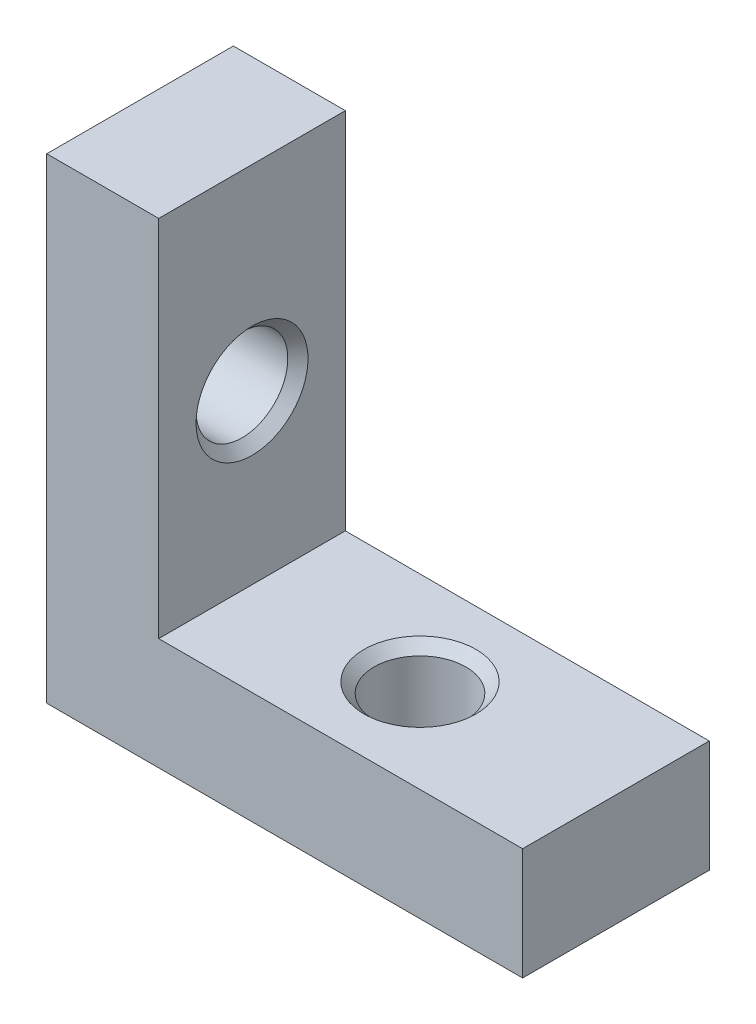
ISO-10303-21;
HEADER;
FILE_DESCRIPTION(('STEP AP214'),'2;1');
FILE_NAME('part.step','',(''),(''),'','','');
FILE_SCHEMA(('AUTOMOTIVE_DESIGN { 1 0 10303 214 1 1 1 1 }'));
ENDSEC;
DATA;
#1=APPLICATION_CONTEXT('core data for automotive mechanical design processes');
#2=APPLICATION_PROTOCOL_DEFINITION('international standard','automotive_design',2000,#1);
#3=PRODUCT_CONTEXT('',#1,'mechanical');
#4=PRODUCT('Part','Part','',(#3));
#5=PRODUCT_RELATED_PRODUCT_CATEGORY('part','',(#4));
#6=PRODUCT_DEFINITION_FORMATION('','',#4);
#7=PRODUCT_DEFINITION_CONTEXT('part definition',#1,'design');
#8=PRODUCT_DEFINITION('design','',#6,#7);
#9=PRODUCT_DEFINITION_SHAPE('','',#8);
#10=(LENGTH_UNIT() NAMED_UNIT(*) SI_UNIT(.MILLI.,.METRE.));
#11=(NAMED_UNIT(*) PLANE_ANGLE_UNIT() SI_UNIT($,.RADIAN.));
#12=(NAMED_UNIT(*) SI_UNIT($,.STERADIAN.) SOLID_ANGLE_UNIT());
#13=UNCERTAINTY_MEASURE_WITH_UNIT(LENGTH_MEASURE(1.E-05),#10,'distance_accuracy_value','');
#14=(GEOMETRIC_REPRESENTATION_CONTEXT(3) GLOBAL_UNCERTAINTY_ASSIGNED_CONTEXT((#13)) GLOBAL_UNIT_ASSIGNED_CONTEXT((#10,
#11,#12)) REPRESENTATION_CONTEXT('',''));
#15=CARTESIAN_POINT('',(0.,0.,0.));
#16=DIRECTION('',(0.,0.,1.));
#17=DIRECTION('',(1.,0.,0.));
#18=AXIS2_PLACEMENT_3D('',#15,#16,#17);
#19=CARTESIAN_POINT('',(0.,0.,5.));
#20=DIRECTION('',(-1.,0.,0.));
#21=DIRECTION('',(0.,0.,1.));
#22=AXIS2_PLACEMENT_3D('',#19,#20,#21);
#23=PLANE('',#22);
#24=DIRECTION('',(0.,0.,1.));
#25=VECTOR('',#24,1.);
#26=CARTESIAN_POINT('',(0.,25.5,5.));
#27=LINE('',#26,#25);
#28=CARTESIAN_POINT('',(0.,25.5,-5.));
#29=VERTEX_POINT('',#28);
#30=CARTESIAN_POINT('',(0.,25.5,5.));
#31=VERTEX_POINT('',#30);
#32=EDGE_CURVE('E111',#29,#31,#27,.T.);
#33=ORIENTED_EDGE('',*,*,#32,.F.);
#34=DIRECTION('',(0.,1.,0.));
#35=VECTOR('',#34,1.);
#36=CARTESIAN_POINT('',(0.,0.,-5.));
#37=LINE('',#36,#35);
#38=CARTESIAN_POINT('',(0.,0.,-5.));
#39=VERTEX_POINT('',#38);
#40=EDGE_CURVE('E109',#39,#29,#37,.T.);
#41=ORIENTED_EDGE('',*,*,#40,.F.);
#42=DIRECTION('',(0.,0.,-1.));
#43=VECTOR('',#42,1.);
#44=CARTESIAN_POINT('',(0.,0.,5.));
#45=LINE('',#44,#43);
#46=CARTESIAN_POINT('',(0.,0.,5.));
#47=VERTEX_POINT('',#46);
#48=EDGE_CURVE('E143',#47,#39,#45,.T.);
#49=ORIENTED_EDGE('',*,*,#48,.F.);
#50=DIRECTION('',(0.,1.,0.));
#51=VECTOR('',#50,1.);
#52=CARTESIAN_POINT('',(0.,0.,5.));
#53=LINE('',#52,#51);
#54=EDGE_CURVE('E139',#47,#31,#53,.T.);
#55=ORIENTED_EDGE('',*,*,#54,.T.);
#56=EDGE_LOOP('',(#33,#41,#49,#55));
#57=FACE_BOUND('',#56,.T.);
#58=CARTESIAN_POINT('',(0.,15.,0.));
#59=DIRECTION('',(-1.,0.,0.));
#60=DIRECTION('',(0.,0.,1.));
#61=AXIS2_PLACEMENT_3D('',#58,#59,#60);
#62=CIRCLE('',#61,3.00000000000002);
#63=CARTESIAN_POINT('',(0.,15.,3.00000000000002));
#64=VERTEX_POINT('',#63);
#65=EDGE_CURVE('E167',#64,#64,#62,.F.);
#66=ORIENTED_EDGE('',*,*,#65,.T.);
#67=EDGE_LOOP('',(#66));
#68=FACE_BOUND('',#67,.T.);
#69=ADVANCED_FACE('F40',(#57,#68),#23,.T.);
#70=CARTESIAN_POINT('',(45.,0.,5.));
#71=DIRECTION('',(0.,-1.,0.));
#72=DIRECTION('',(0.,0.,-1.));
#73=AXIS2_PLACEMENT_3D('',#70,#71,#72);
#74=PLANE('',#73);
#75=DIRECTION('',(0.,0.,-1.));
#76=VECTOR('',#75,1.);
#77=CARTESIAN_POINT('',(25.5,0.,5.));
#78=LINE('',#77,#76);
#79=CARTESIAN_POINT('',(25.5,0.,5.));
#80=VERTEX_POINT('',#79);
#81=CARTESIAN_POINT('',(25.5,0.,-5.));
#82=VERTEX_POINT('',#81);
#83=EDGE_CURVE('E128',#80,#82,#78,.T.);
#84=ORIENTED_EDGE('',*,*,#83,.F.);
#85=DIRECTION('',(-1.,0.,0.));
#86=VECTOR('',#85,1.);
#87=CARTESIAN_POINT('',(45.,0.,5.));
#88=LINE('',#87,#86);
#89=EDGE_CURVE('E136',#80,#47,#88,.T.);
#90=ORIENTED_EDGE('',*,*,#89,.T.);
#91=ORIENTED_EDGE('',*,*,#48,.T.);
#92=DIRECTION('',(-1.,0.,0.));
#93=VECTOR('',#92,1.);
#94=CARTESIAN_POINT('',(45.,0.,-5.));
#95=LINE('',#94,#93);
#96=EDGE_CURVE('E135',#82,#39,#95,.T.);
#97=ORIENTED_EDGE('',*,*,#96,.F.);
#98=EDGE_LOOP('',(#84,#90,#91,#97));
#99=FACE_BOUND('',#98,.T.);
#100=CARTESIAN_POINT('',(15.,0.,0.));
#101=DIRECTION('',(0.,-1.,0.));
#102=DIRECTION('',(0.,0.,-1.));
#103=AXIS2_PLACEMENT_3D('',#100,#101,#102);
#104=CIRCLE('',#103,3.);
#105=CARTESIAN_POINT('',(15.,0.,-3.));
#106=VERTEX_POINT('',#105);
#107=EDGE_CURVE('E151',#106,#106,#104,.F.);
#108=ORIENTED_EDGE('',*,*,#107,.T.);
#109=EDGE_LOOP('',(#108));
#110=FACE_BOUND('',#109,.T.);
#111=ADVANCED_FACE('F193',(#99,#110),#74,.T.);
#112=CARTESIAN_POINT('',(0.,0.,5.));
#113=DIRECTION('',(0.,0.,-1.));
#114=DIRECTION('',(-1.,0.,0.));
#115=AXIS2_PLACEMENT_3D('',#112,#113,#114);
#116=PLANE('',#115);
#117=DIRECTION('',(0.,-1.,0.));
#118=VECTOR('',#117,1.);
#119=CARTESIAN_POINT('',(6.,45.,5.));
#120=LINE('',#119,#118);
#121=CARTESIAN_POINT('',(6.,25.5,5.));
#122=VERTEX_POINT('',#121);
#123=CARTESIAN_POINT('',(6.,6.,5.));
#124=VERTEX_POINT('',#123);
#125=EDGE_CURVE('E125',#122,#124,#120,.T.);
#126=ORIENTED_EDGE('',*,*,#125,.F.);
#127=DIRECTION('',(1.,0.,0.));
#128=VECTOR('',#127,1.);
#129=CARTESIAN_POINT('',(-4.,25.5,5.));
#130=LINE('',#129,#128);
#131=EDGE_CURVE('E57',#31,#122,#130,.T.);
#132=ORIENTED_EDGE('',*,*,#131,.F.);
#133=ORIENTED_EDGE('',*,*,#54,.F.);
#134=ORIENTED_EDGE('',*,*,#89,.F.);
#135=DIRECTION('',(0.,1.,0.));
#136=VECTOR('',#135,1.);
#137=CARTESIAN_POINT('',(25.5,-4.,5.));
#138=LINE('',#137,#136);
#139=CARTESIAN_POINT('',(25.5,6.,5.));
#140=VERTEX_POINT('',#139);
#141=EDGE_CURVE('E259',#80,#140,#138,.T.);
#142=ORIENTED_EDGE('',*,*,#141,.T.);
#143=DIRECTION('',(1.,0.,0.));
#144=VECTOR('',#143,1.);
#145=CARTESIAN_POINT('',(6.,6.,5.));
#146=LINE('',#145,#144);
#147=EDGE_CURVE('E119',#124,#140,#146,.T.);
#148=ORIENTED_EDGE('',*,*,#147,.F.);
#149=EDGE_LOOP('',(#126,#132,#133,#134,#142,#148));
#150=FACE_BOUND('',#149,.T.);
#151=ADVANCED_FACE('F201',(#150),#116,.F.);
#152=CARTESIAN_POINT('',(0.,0.,-5.));
#153=DIRECTION('',(0.,0.,-1.));
#154=DIRECTION('',(-1.,0.,0.));
#155=AXIS2_PLACEMENT_3D('',#152,#153,#154);
#156=PLANE('',#155);
#157=DIRECTION('',(1.,0.,0.));
#158=VECTOR('',#157,1.);
#159=CARTESIAN_POINT('',(-4.,25.5,-5.));
#160=LINE('',#159,#158);
#161=CARTESIAN_POINT('',(6.,25.5,-5.));
#162=VERTEX_POINT('',#161);
#163=EDGE_CURVE('E95',#29,#162,#160,.T.);
#164=ORIENTED_EDGE('',*,*,#163,.T.);
#165=DIRECTION('',(0.,-1.,0.));
#166=VECTOR('',#165,1.);
#167=CARTESIAN_POINT('',(6.,45.,-5.));
#168=LINE('',#167,#166);
#169=CARTESIAN_POINT('',(6.,6.,-5.));
#170=VERTEX_POINT('',#169);
#171=EDGE_CURVE('E106',#162,#170,#168,.T.);
#172=ORIENTED_EDGE('',*,*,#171,.T.);
#173=DIRECTION('',(1.,0.,0.));
#174=VECTOR('',#173,1.);
#175=CARTESIAN_POINT('',(6.,6.,-5.));
#176=LINE('',#175,#174);
#177=CARTESIAN_POINT('',(25.5,6.,-5.));
#178=VERTEX_POINT('',#177);
#179=EDGE_CURVE('E118',#170,#178,#176,.T.);
#180=ORIENTED_EDGE('',*,*,#179,.T.);
#181=DIRECTION('',(0.,1.,0.));
#182=VECTOR('',#181,1.);
#183=CARTESIAN_POINT('',(25.5,-4.,-5.));
#184=LINE('',#183,#182);
#185=EDGE_CURVE('E65',#82,#178,#184,.T.);
#186=ORIENTED_EDGE('',*,*,#185,.F.);
#187=ORIENTED_EDGE('',*,*,#96,.T.);
#188=ORIENTED_EDGE('',*,*,#40,.T.);
#189=EDGE_LOOP('',(#164,#172,#180,#186,#187,#188));
#190=FACE_BOUND('',#189,.T.);
#191=ADVANCED_FACE('F104',(#190),#156,.T.);
#192=CARTESIAN_POINT('',(6.,6.,-5.));
#193=DIRECTION('',(0.,-1.,0.));
#194=DIRECTION('',(0.,0.,-1.));
#195=AXIS2_PLACEMENT_3D('',#192,#193,#194);
#196=PLANE('',#195);
#197=CARTESIAN_POINT('',(15.,6.,0.));
#198=DIRECTION('',(0.,-1.,0.));
#199=DIRECTION('',(0.,0.,-1.));
#200=AXIS2_PLACEMENT_3D('',#197,#198,#199);
#201=CIRCLE('',#200,3.00000000000001);
#202=CARTESIAN_POINT('',(15.,6.,-3.00000000000001));
#203=VERTEX_POINT('',#202);
#204=EDGE_CURVE('E163',#203,#203,#201,.T.);
#205=ORIENTED_EDGE('',*,*,#204,.T.);
#206=EDGE_LOOP('',(#205));
#207=FACE_BOUND('',#206,.T.);
#208=ORIENTED_EDGE('',*,*,#147,.T.);
#209=DIRECTION('',(0.,0.,1.));
#210=VECTOR('',#209,1.);
#211=CARTESIAN_POINT('',(25.5,6.,-5.));
#212=LINE('',#211,#210);
#213=EDGE_CURVE('E256',#178,#140,#212,.T.);
#214=ORIENTED_EDGE('',*,*,#213,.F.);
#215=ORIENTED_EDGE('',*,*,#179,.F.);
#216=DIRECTION('',(0.,0.,1.));
#217=VECTOR('',#216,1.);
#218=CARTESIAN_POINT('',(6.,6.,-5.));
#219=LINE('',#218,#217);
#220=EDGE_CURVE('E116',#170,#124,#219,.T.);
#221=ORIENTED_EDGE('',*,*,#220,.T.);
#222=EDGE_LOOP('',(#208,#214,#215,#221));
#223=FACE_BOUND('',#222,.T.);
#224=ADVANCED_FACE('F242',(#207,#223),#196,.F.);
#225=CARTESIAN_POINT('',(6.,45.,-5.));
#226=DIRECTION('',(-1.,0.,0.));
#227=DIRECTION('',(0.,0.,1.));
#228=AXIS2_PLACEMENT_3D('',#225,#226,#227);
#229=PLANE('',#228);
#230=CARTESIAN_POINT('',(6.,15.,0.));
#231=DIRECTION('',(-1.,0.,0.));
#232=DIRECTION('',(0.,0.,1.));
#233=AXIS2_PLACEMENT_3D('',#230,#231,#232);
#234=CIRCLE('',#233,3.);
#235=CARTESIAN_POINT('',(6.,15.,3.));
#236=VERTEX_POINT('',#235);
#237=EDGE_CURVE('E171',#236,#236,#234,.T.);
#238=ORIENTED_EDGE('',*,*,#237,.T.);
#239=EDGE_LOOP('',(#238));
#240=FACE_BOUND('',#239,.T.);
#241=ORIENTED_EDGE('',*,*,#171,.F.);
#242=DIRECTION('',(0.,0.,-1.));
#243=VECTOR('',#242,1.);
#244=CARTESIAN_POINT('',(6.,25.5,5.));
#245=LINE('',#244,#243);
#246=EDGE_CURVE('E92',#122,#162,#245,.T.);
#247=ORIENTED_EDGE('',*,*,#246,.F.);
#248=ORIENTED_EDGE('',*,*,#125,.T.);
#249=ORIENTED_EDGE('',*,*,#220,.F.);
#250=EDGE_LOOP('',(#241,#247,#248,#249));
#251=FACE_BOUND('',#250,.T.);
#252=ADVANCED_FACE('F114',(#240,#251),#229,.F.);
#253=CARTESIAN_POINT('',(15.,6.,0.));
#254=DIRECTION('',(0.,1.,0.));
#255=DIRECTION('',(0.,0.,1.));
#256=AXIS2_PLACEMENT_3D('',#253,#254,#255);
#257=CYLINDRICAL_SURFACE('',#256,2.45875000000001);
#258=CARTESIAN_POINT('',(15.,0.541249999999985,0.));
#259=DIRECTION('',(0.,-1.,0.));
#260=DIRECTION('',(0.,0.,-1.));
#261=AXIS2_PLACEMENT_3D('',#258,#259,#260);
#262=CIRCLE('',#261,2.45875000000001);
#263=CARTESIAN_POINT('',(15.,0.541249999999985,-2.45875000000001));
#264=VERTEX_POINT('',#263);
#265=EDGE_CURVE('E159',#264,#264,#262,.T.);
#266=ORIENTED_EDGE('',*,*,#265,.T.);
#267=EDGE_LOOP('',(#266));
#268=FACE_BOUND('',#267,.T.);
#269=CARTESIAN_POINT('',(15.,5.45875000000001,0.));
#270=DIRECTION('',(0.,-1.,0.));
#271=DIRECTION('',(0.,0.,-1.));
#272=AXIS2_PLACEMENT_3D('',#269,#270,#271);
#273=CIRCLE('',#272,2.45875000000001);
#274=CARTESIAN_POINT('',(15.,5.45875000000001,-2.45875000000001));
#275=VERTEX_POINT('',#274);
#276=EDGE_CURVE('E155',#275,#275,#273,.F.);
#277=ORIENTED_EDGE('',*,*,#276,.T.);
#278=EDGE_LOOP('',(#277));
#279=FACE_BOUND('',#278,.T.);
#280=ADVANCED_FACE('F231',(#268,#279),#257,.F.);
#281=CARTESIAN_POINT('',(0.,15.,0.));
#282=DIRECTION('',(-1.,0.,0.));
#283=DIRECTION('',(0.,0.,1.));
#284=AXIS2_PLACEMENT_3D('',#281,#282,#283);
#285=CYLINDRICAL_SURFACE('',#284,2.45875000000001);
#286=CARTESIAN_POINT('',(5.45875000000001,15.,0.));
#287=DIRECTION('',(-1.,0.,0.));
#288=DIRECTION('',(0.,0.,1.));
#289=AXIS2_PLACEMENT_3D('',#286,#287,#288);
#290=CIRCLE('',#289,2.45875000000001);
#291=CARTESIAN_POINT('',(5.45875000000001,15.,2.45875000000001));
#292=VERTEX_POINT('',#291);
#293=EDGE_CURVE('E11',#292,#292,#290,.F.);
#294=ORIENTED_EDGE('',*,*,#293,.T.);
#295=EDGE_LOOP('',(#294));
#296=FACE_BOUND('',#295,.T.);
#297=CARTESIAN_POINT('',(0.541250000000013,15.,0.));
#298=DIRECTION('',(-1.,0.,0.));
#299=DIRECTION('',(0.,0.,1.));
#300=AXIS2_PLACEMENT_3D('',#297,#298,#299);
#301=CIRCLE('',#300,2.45875000000001);
#302=CARTESIAN_POINT('',(0.541250000000013,15.,2.45875000000001));
#303=VERTEX_POINT('',#302);
#304=EDGE_CURVE('E50',#303,#303,#301,.T.);
#305=ORIENTED_EDGE('',*,*,#304,.T.);
#306=EDGE_LOOP('',(#305));
#307=FACE_BOUND('',#306,.T.);
#308=ADVANCED_FACE('F178',(#296,#307),#285,.F.);
#309=CARTESIAN_POINT('',(15.,0.,0.));
#310=DIRECTION('',(0.,-1.,0.));
#311=DIRECTION('',(0.,0.,-1.));
#312=AXIS2_PLACEMENT_3D('',#309,#310,#311);
#313=CONICAL_SURFACE('',#312,3.,0.785398163397452);
#314=ORIENTED_EDGE('',*,*,#265,.F.);
#315=EDGE_LOOP('',(#314));
#316=FACE_BOUND('',#315,.T.);
#317=ORIENTED_EDGE('',*,*,#107,.F.);
#318=EDGE_LOOP('',(#317));
#319=FACE_BOUND('',#318,.T.);
#320=ADVANCED_FACE('F209',(#316,#319),#313,.F.);
#321=CARTESIAN_POINT('',(15.,5.45875000000001,0.));
#322=DIRECTION('',(0.,1.,0.));
#323=DIRECTION('',(0.,0.,1.));
#324=AXIS2_PLACEMENT_3D('',#321,#322,#323);
#325=CONICAL_SURFACE('',#324,2.45875000000001,0.785398163397457);
#326=ORIENTED_EDGE('',*,*,#204,.F.);
#327=EDGE_LOOP('',(#326));
#328=FACE_BOUND('',#327,.T.);
#329=ORIENTED_EDGE('',*,*,#276,.F.);
#330=EDGE_LOOP('',(#329));
#331=FACE_BOUND('',#330,.T.);
#332=ADVANCED_FACE('F189',(#328,#331),#325,.F.);
#333=CARTESIAN_POINT('',(6.,15.,0.));
#334=DIRECTION('',(1.,0.,0.));
#335=DIRECTION('',(0.,0.,-1.));
#336=AXIS2_PLACEMENT_3D('',#333,#334,#335);
#337=CONICAL_SURFACE('',#336,3.,0.785398163397447);
#338=ORIENTED_EDGE('',*,*,#293,.F.);
#339=EDGE_LOOP('',(#338));
#340=FACE_BOUND('',#339,.T.);
#341=ORIENTED_EDGE('',*,*,#237,.F.);
#342=EDGE_LOOP('',(#341));
#343=FACE_BOUND('',#342,.T.);
#344=ADVANCED_FACE('F182',(#340,#343),#337,.F.);
#345=CARTESIAN_POINT('',(0.541250000000013,15.,0.));
#346=DIRECTION('',(-1.,0.,0.));
#347=DIRECTION('',(0.,0.,1.));
#348=AXIS2_PLACEMENT_3D('',#345,#346,#347);
#349=CONICAL_SURFACE('',#348,2.45875000000001,0.785398163397449);
#350=ORIENTED_EDGE('',*,*,#65,.F.);
#351=EDGE_LOOP('',(#350));
#352=FACE_BOUND('',#351,.T.);
#353=ORIENTED_EDGE('',*,*,#304,.F.);
#354=EDGE_LOOP('',(#353));
#355=FACE_BOUND('',#354,.T.);
#356=ADVANCED_FACE('F43',(#352,#355),#349,.F.);
#357=CARTESIAN_POINT('',(25.5,-4.,-5.));
#358=DIRECTION('',(-1.,0.,0.));
#359=DIRECTION('',(0.,0.,1.));
#360=AXIS2_PLACEMENT_3D('',#357,#358,#359);
#361=PLANE('',#360);
#362=ORIENTED_EDGE('',*,*,#83,.T.);
#363=ORIENTED_EDGE('',*,*,#185,.T.);
#364=ORIENTED_EDGE('',*,*,#213,.T.);
#365=ORIENTED_EDGE('',*,*,#141,.F.);
#366=EDGE_LOOP('',(#362,#363,#364,#365));
#367=FACE_BOUND('',#366,.T.);
#368=ADVANCED_FACE('F181',(#367),#361,.F.);
#369=CARTESIAN_POINT('',(-4.,25.5,5.));
#370=DIRECTION('',(0.,-1.,0.));
#371=DIRECTION('',(0.,0.,-1.));
#372=AXIS2_PLACEMENT_3D('',#369,#370,#371);
#373=PLANE('',#372);
#374=ORIENTED_EDGE('',*,*,#32,.T.);
#375=ORIENTED_EDGE('',*,*,#131,.T.);
#376=ORIENTED_EDGE('',*,*,#246,.T.);
#377=ORIENTED_EDGE('',*,*,#163,.F.);
#378=EDGE_LOOP('',(#374,#375,#376,#377));
#379=FACE_BOUND('',#378,.T.);
#380=ADVANCED_FACE('F94',(#379),#373,.F.);
#381=CLOSED_SHELL('',(#69,#111,#151,#191,#224,#252,#280,#308,#320,#332,#344,#356,#368,#380));
#382=MANIFOLD_SOLID_BREP('B2',#381);
#383=ADVANCED_BREP_SHAPE_REPRESENTATION('',(#18,#382),#14);
#384=SHAPE_DEFINITION_REPRESENTATION(#9,#383);
ENDSEC;
END-ISO-10303-21;
